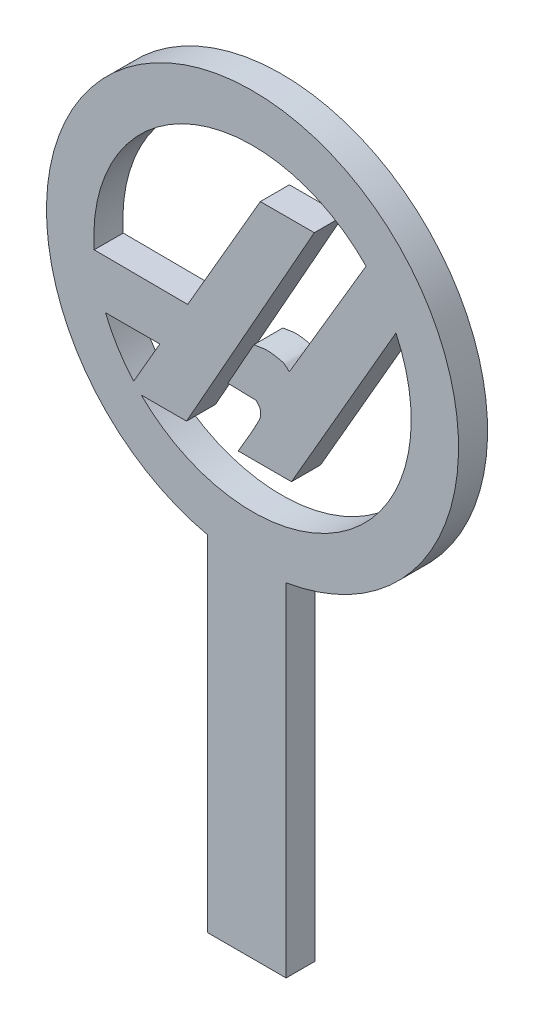
ISO-10303-21;
HEADER;
FILE_DESCRIPTION(('STEP AP214'),'2;1');
FILE_NAME('part.step','',(''),(''),'','','');
FILE_SCHEMA(('AUTOMOTIVE_DESIGN { 1 0 10303 214 1 1 1 1 }'));
ENDSEC;
DATA;
#1=APPLICATION_CONTEXT('core data for automotive mechanical design processes');
#2=APPLICATION_PROTOCOL_DEFINITION('international standard','automotive_design',2000,#1);
#3=PRODUCT_CONTEXT('',#1,'mechanical');
#4=PRODUCT('Part','Part','',(#3));
#5=PRODUCT_RELATED_PRODUCT_CATEGORY('part','',(#4));
#6=PRODUCT_DEFINITION_FORMATION('','',#4);
#7=PRODUCT_DEFINITION_CONTEXT('part definition',#1,'design');
#8=PRODUCT_DEFINITION('design','',#6,#7);
#9=PRODUCT_DEFINITION_SHAPE('','',#8);
#10=(LENGTH_UNIT() NAMED_UNIT(*) SI_UNIT(.MILLI.,.METRE.));
#11=(NAMED_UNIT(*) PLANE_ANGLE_UNIT() SI_UNIT($,.RADIAN.));
#12=(NAMED_UNIT(*) SI_UNIT($,.STERADIAN.) SOLID_ANGLE_UNIT());
#13=UNCERTAINTY_MEASURE_WITH_UNIT(LENGTH_MEASURE(1.E-05),#10,'distance_accuracy_value','');
#14=(GEOMETRIC_REPRESENTATION_CONTEXT(3) GLOBAL_UNCERTAINTY_ASSIGNED_CONTEXT((#13)) GLOBAL_UNIT_ASSIGNED_CONTEXT((#10,
#11,#12)) REPRESENTATION_CONTEXT('',''));
#15=CARTESIAN_POINT('',(0.,0.,0.));
#16=DIRECTION('',(0.,0.,1.));
#17=DIRECTION('',(1.,0.,0.));
#18=AXIS2_PLACEMENT_3D('',#15,#16,#17);
#19=CARTESIAN_POINT('',(456.634031843673,370.7972397232,50.));
#20=DIRECTION('',(0.,0.,1.));
#21=DIRECTION('',(1.,0.,0.));
#22=AXIS2_PLACEMENT_3D('',#19,#20,#21);
#23=PLANE('',#22);
#24=DIRECTION('',(0.,1.,0.));
#25=VECTOR('',#24,1.);
#26=CARTESIAN_POINT('',(514.521168615173,-568.699042703646,50.));
#27=LINE('',#26,#25);
#28=CARTESIAN_POINT('',(514.521168615173,-568.699042703646,50.));
#29=VERTEX_POINT('',#28);
#30=CARTESIAN_POINT('',(514.521168615173,20.7590938354721,50.));
#31=VERTEX_POINT('',#30);
#32=EDGE_CURVE('E347',#29,#31,#27,.T.);
#33=ORIENTED_EDGE('',*,*,#32,.T.);
#34=CARTESIAN_POINT('',(456.634031843673,370.7972397232,50.));
#35=DIRECTION('',(0.,0.,1.));
#36=DIRECTION('',(1.,0.,0.));
#37=AXIS2_PLACEMENT_3D('',#34,#35,#36);
#38=CIRCLE('',#37,354.792367702746);
#39=CARTESIAN_POINT('',(379.382767373746,24.5171994120119,50.));
#40=VERTEX_POINT('',#39);
#41=EDGE_CURVE('E364',#31,#40,#38,.T.);
#42=ORIENTED_EDGE('',*,*,#41,.T.);
#43=DIRECTION('',(0.,-1.,0.));
#44=VECTOR('',#43,1.);
#45=CARTESIAN_POINT('',(379.382767373746,-568.699042703646,50.));
#46=LINE('',#45,#44);
#47=CARTESIAN_POINT('',(379.382767373746,-568.699042703646,50.));
#48=VERTEX_POINT('',#47);
#49=EDGE_CURVE('E338',#40,#48,#46,.T.);
#50=ORIENTED_EDGE('',*,*,#49,.T.);
#51=DIRECTION('',(1.,0.,0.));
#52=VECTOR('',#51,1.);
#53=CARTESIAN_POINT('',(514.521168615173,-568.699042703646,50.));
#54=LINE('',#53,#52);
#55=EDGE_CURVE('E355',#48,#29,#54,.T.);
#56=ORIENTED_EDGE('',*,*,#55,.T.);
#57=EDGE_LOOP('',(#33,#42,#50,#56));
#58=FACE_BOUND('',#57,.T.);
#59=DIRECTION('',(0.999980711178834,-0.00621106031788096,0.));
#60=VECTOR('',#59,1.);
#61=CARTESIAN_POINT('',(344.999999995328,351.000000011869,50.));
#62=LINE('',#61,#60);
#63=CARTESIAN_POINT('',(183.999999995328,352.000000011869,50.));
#64=VERTEX_POINT('',#63);
#65=CARTESIAN_POINT('',(344.999999995328,351.000000011869,50.));
#66=VERTEX_POINT('',#65);
#67=EDGE_CURVE('E222',#64,#66,#62,.T.);
#68=ORIENTED_EDGE('',*,*,#67,.F.);
#69=CARTESIAN_POINT('',(456.634031843673,370.7972397232,50.));
#70=DIRECTION('',(0.,0.,1.));
#71=DIRECTION('',(1.,0.,0.));
#72=AXIS2_PLACEMENT_3D('',#69,#70,#71);
#73=CIRCLE('',#72,273.281268188381);
#74=CARTESIAN_POINT('',(652.184505988232,561.696856287739,50.));
#75=VERTEX_POINT('',#74);
#76=EDGE_CURVE('E219',#75,#64,#73,.T.);
#77=ORIENTED_EDGE('',*,*,#76,.F.);
#78=DIRECTION('',(0.508729312126642,0.860926528214315,0.));
#79=VECTOR('',#78,1.);
#80=CARTESIAN_POINT('',(652.184505988232,561.696856287739,50.));
#81=LINE('',#80,#79);
#82=CARTESIAN_POINT('',(520.000000000014,337.999999999987,50.));
#83=VERTEX_POINT('',#82);
#84=EDGE_CURVE('E462',#83,#75,#81,.T.);
#85=ORIENTED_EDGE('',*,*,#84,.F.);
#86=CARTESIAN_POINT('',(459.000000000014,347.999999999985,50.));
#87=CARTESIAN_POINT('',(477.851743634498,351.141957272399,50.));
#88=CARTESIAN_POINT('',(483.294181496903,353.05040453136,50.));
#89=CARTESIAN_POINT('',(508.000000000014,346.999999999986,50.));
#90=CARTESIAN_POINT('',(512.856486558174,345.81065635309,50.));
#91=CARTESIAN_POINT('',(516.000000000014,340.999999999987,50.));
#92=CARTESIAN_POINT('',(520.000000000014,337.999999999987,50.));
#93=B_SPLINE_CURVE_WITH_KNOTS('',3,(#86,#87,#88,#89,#90,#91,#92),.UNSPECIFIED.,.F.,.F.,(4,3,4),
(0.,1.,2.),.UNSPECIFIED.);
#94=CARTESIAN_POINT('',(459.000000000014,347.999999999985,50.));
#95=VERTEX_POINT('',#94);
#96=EDGE_CURVE('E494',#95,#83,#93,.T.);
#97=ORIENTED_EDGE('',*,*,#96,.F.);
#98=DIRECTION('',(0.488992524128992,0.872287975009376,0.));
#99=VECTOR('',#98,1.);
#100=CARTESIAN_POINT('',(459.000000000014,347.999999999985,50.));
#101=LINE('',#100,#99);
#102=CARTESIAN_POINT('',(414.153111070255,268.000000000617,50.));
#103=VERTEX_POINT('',#102);
#104=EDGE_CURVE('E497',#103,#95,#101,.T.);
#105=ORIENTED_EDGE('',*,*,#104,.F.);
#106=DIRECTION('',(-0.999790511734195,0.020467844201998,0.));
#107=VECTOR('',#106,1.);
#108=CARTESIAN_POINT('',(414.153111070255,268.000000000617,50.));
#109=LINE('',#108,#107);
#110=CARTESIAN_POINT('',(463.000000000014,266.999999999985,50.));
#111=VERTEX_POINT('',#110);
#112=EDGE_CURVE('E253',#111,#103,#109,.T.);
#113=ORIENTED_EDGE('',*,*,#112,.F.);
#114=CARTESIAN_POINT('',(432.000000000013,175.999999999985,50.));
#115=CARTESIAN_POINT('',(444.333333333347,197.999999999985,50.));
#116=CARTESIAN_POINT('',(458.288028235039,219.166586500959,50.));
#117=CARTESIAN_POINT('',(469.000000000014,241.999999999985,50.));
#118=CARTESIAN_POINT('',(471.128314938588,246.536671316419,50.));
#119=CARTESIAN_POINT('',(471.169454920433,252.127271164905,50.));
#120=CARTESIAN_POINT('',(470.000000000014,256.999999999985,50.));
#121=CARTESIAN_POINT('',(469.050440025481,260.956499893871,50.));
#122=CARTESIAN_POINT('',(465.333333333347,263.666666666652,50.));
#123=CARTESIAN_POINT('',(463.000000000014,266.999999999985,50.));
#124=B_SPLINE_CURVE_WITH_KNOTS('',3,(#114,#115,#116,#117,#118,#119,#120,#121,#122,#123),
.UNSPECIFIED.,.F.,.F.,(4,3,3,4),(0.,1.,2.,3.),.UNSPECIFIED.);
#125=CARTESIAN_POINT('',(432.000000000013,175.999999999985,50.));
#126=VERTEX_POINT('',#125);
#127=EDGE_CURVE('E247',#126,#111,#124,.T.);
#128=ORIENTED_EDGE('',*,*,#127,.F.);
#129=DIRECTION('',(-1.,0.,0.));
#130=VECTOR('',#129,1.);
#131=CARTESIAN_POINT('',(432.000000000013,175.999999999985,50.));
#132=LINE('',#131,#130);
#133=CARTESIAN_POINT('',(523.78372406925,175.999999999985,50.));
#134=VERTEX_POINT('',#133);
#135=EDGE_CURVE('E244',#134,#126,#132,.T.);
#136=ORIENTED_EDGE('',*,*,#135,.F.);
#137=DIRECTION('',(-0.499610631852908,-0.866250088911705,0.));
#138=VECTOR('',#137,1.);
#139=CARTESIAN_POINT('',(523.78372406925,175.999999999985,50.));
#140=LINE('',#139,#138);
#141=CARTESIAN_POINT('',(703.607534397801,487.78758367857,50.));
#142=VERTEX_POINT('',#141);
#143=EDGE_CURVE('E241',#142,#134,#140,.T.);
#144=ORIENTED_EDGE('',*,*,#143,.F.);
#145=CARTESIAN_POINT('',(456.634031843673,370.7972397232,50.));
#146=DIRECTION('',(0.,0.,1.));
#147=DIRECTION('',(1.,0.,0.));
#148=AXIS2_PLACEMENT_3D('',#145,#146,#147);
#149=CIRCLE('',#148,273.281268188381);
#150=CARTESIAN_POINT('',(264.996930573145,175.969436370395,50.));
#151=VERTEX_POINT('',#150);
#152=EDGE_CURVE('E238',#151,#142,#149,.T.);
#153=ORIENTED_EDGE('',*,*,#152,.F.);
#154=DIRECTION('',(-0.999999923235036,-0.000391828944071524,0.));
#155=VECTOR('',#154,1.);
#156=CARTESIAN_POINT('',(264.996930573145,175.969436370395,50.));
#157=LINE('',#156,#155);
#158=CARTESIAN_POINT('',(342.999405137408,175.999999999985,50.));
#159=VERTEX_POINT('',#158);
#160=EDGE_CURVE('E235',#159,#151,#157,.T.);
#161=ORIENTED_EDGE('',*,*,#160,.F.);
#162=DIRECTION('',(-0.490368068183299,-0.871515437445706,0.));
#163=VECTOR('',#162,1.);
#164=CARTESIAN_POINT('',(342.999405137408,175.999999999985,50.));
#165=LINE('',#164,#163);
#166=CARTESIAN_POINT('',(562.999999995105,567.000000012326,50.));
#167=VERTEX_POINT('',#166);
#168=EDGE_CURVE('E232',#167,#159,#165,.T.);
#169=ORIENTED_EDGE('',*,*,#168,.F.);
#170=DIRECTION('',(1.,0.,0.));
#171=VECTOR('',#170,1.);
#172=CARTESIAN_POINT('',(562.999999995105,567.000000012326,50.));
#173=LINE('',#172,#171);
#174=CARTESIAN_POINT('',(470.080751257169,567.000000012326,50.));
#175=VERTEX_POINT('',#174);
#176=EDGE_CURVE('E229',#175,#167,#173,.T.);
#177=ORIENTED_EDGE('',*,*,#176,.F.);
#178=DIRECTION('',(0.501120644832425,0.865377431715627,0.));
#179=VECTOR('',#178,1.);
#180=CARTESIAN_POINT('',(470.080751257169,567.000000012326,50.));
#181=LINE('',#180,#179);
#182=EDGE_CURVE('E226',#66,#175,#181,.T.);
#183=ORIENTED_EDGE('',*,*,#182,.F.);
#184=EDGE_LOOP('',(#68,#77,#85,#97,#105,#113,#128,#136,#144,#153,#161,#169,#177,#183));
#185=FACE_BOUND('',#184,.T.);
#186=DIRECTION('',(0.499722453489577,0.866185586048601,0.));
#187=VECTOR('',#186,1.);
#188=CARTESIAN_POINT('',(297.000000000021,268.000000000617,50.));
#189=LINE('',#188,#187);
#190=CARTESIAN_POINT('',(251.884299831457,189.799453041773,50.));
#191=VERTEX_POINT('',#190);
#192=CARTESIAN_POINT('',(297.000000000021,268.000000000617,50.));
#193=VERTEX_POINT('',#192);
#194=EDGE_CURVE('E192',#191,#193,#189,.T.);
#195=ORIENTED_EDGE('',*,*,#194,.F.);
#196=CARTESIAN_POINT('',(456.634031843673,370.7972397232,50.));
#197=DIRECTION('',(0.,0.,1.));
#198=DIRECTION('',(1.,0.,0.));
#199=AXIS2_PLACEMENT_3D('',#196,#197,#198);
#200=CIRCLE('',#199,273.281268188381);
#201=CARTESIAN_POINT('',(203.423883847848,268.000000000617,50.));
#202=VERTEX_POINT('',#201);
#203=EDGE_CURVE('E183',#202,#191,#200,.T.);
#204=ORIENTED_EDGE('',*,*,#203,.F.);
#205=DIRECTION('',(-1.,0.,0.));
#206=VECTOR('',#205,1.);
#207=CARTESIAN_POINT('',(203.423883847848,268.000000000617,50.));
#208=LINE('',#207,#206);
#209=EDGE_CURVE('E202',#193,#202,#208,.T.);
#210=ORIENTED_EDGE('',*,*,#209,.F.);
#211=EDGE_LOOP('',(#195,#204,#210));
#212=FACE_BOUND('',#211,.T.);
#213=ADVANCED_FACE('F39',(#58,#185,#212),#23,.T.);
#214=CARTESIAN_POINT('',(456.634031843673,370.7972397232,0.));
#215=DIRECTION('',(0.,0.,1.));
#216=DIRECTION('',(1.,0.,0.));
#217=AXIS2_PLACEMENT_3D('',#214,#215,#216);
#218=PLANE('',#217);
#219=CARTESIAN_POINT('',(456.634031843673,370.7972397232,0.));
#220=DIRECTION('',(0.,0.,1.));
#221=DIRECTION('',(1.,0.,0.));
#222=AXIS2_PLACEMENT_3D('',#219,#220,#221);
#223=CIRCLE('',#222,273.281268188381);
#224=CARTESIAN_POINT('',(652.184505988232,561.696856287739,0.));
#225=VERTEX_POINT('',#224);
#226=CARTESIAN_POINT('',(183.999999995328,352.000000011869,0.));
#227=VERTEX_POINT('',#226);
#228=EDGE_CURVE('E200',#225,#227,#223,.T.);
#229=ORIENTED_EDGE('',*,*,#228,.T.);
#230=DIRECTION('',(0.999980711178834,-0.00621106031788096,0.));
#231=VECTOR('',#230,1.);
#232=CARTESIAN_POINT('',(344.999999995328,351.000000011869,0.));
#233=LINE('',#232,#231);
#234=CARTESIAN_POINT('',(344.999999995328,351.000000011869,0.));
#235=VERTEX_POINT('',#234);
#236=EDGE_CURVE('E398',#227,#235,#233,.T.);
#237=ORIENTED_EDGE('',*,*,#236,.T.);
#238=DIRECTION('',(0.501120644832425,0.865377431715627,0.));
#239=VECTOR('',#238,1.);
#240=CARTESIAN_POINT('',(470.080751257169,567.000000012326,0.));
#241=LINE('',#240,#239);
#242=CARTESIAN_POINT('',(470.080751257169,567.000000012326,0.));
#243=VERTEX_POINT('',#242);
#244=EDGE_CURVE('E392',#235,#243,#241,.T.);
#245=ORIENTED_EDGE('',*,*,#244,.T.);
#246=DIRECTION('',(1.,0.,0.));
#247=VECTOR('',#246,1.);
#248=CARTESIAN_POINT('',(562.999999995105,567.000000012326,0.));
#249=LINE('',#248,#247);
#250=CARTESIAN_POINT('',(562.999999995105,567.000000012326,0.));
#251=VERTEX_POINT('',#250);
#252=EDGE_CURVE('E397',#243,#251,#249,.T.);
#253=ORIENTED_EDGE('',*,*,#252,.T.);
#254=DIRECTION('',(-0.490368068183299,-0.871515437445706,0.));
#255=VECTOR('',#254,1.);
#256=CARTESIAN_POINT('',(342.999405137408,175.999999999985,0.));
#257=LINE('',#256,#255);
#258=CARTESIAN_POINT('',(342.999405137408,175.999999999985,0.));
#259=VERTEX_POINT('',#258);
#260=EDGE_CURVE('E409',#251,#259,#257,.T.);
#261=ORIENTED_EDGE('',*,*,#260,.T.);
#262=DIRECTION('',(-0.999999923235036,-0.000391828944071524,0.));
#263=VECTOR('',#262,1.);
#264=CARTESIAN_POINT('',(264.996930573145,175.969436370395,0.));
#265=LINE('',#264,#263);
#266=CARTESIAN_POINT('',(264.996930573145,175.969436370395,0.));
#267=VERTEX_POINT('',#266);
#268=EDGE_CURVE('E413',#259,#267,#265,.T.);
#269=ORIENTED_EDGE('',*,*,#268,.T.);
#270=CARTESIAN_POINT('',(456.634031843673,370.7972397232,0.));
#271=DIRECTION('',(0.,0.,1.));
#272=DIRECTION('',(1.,0.,0.));
#273=AXIS2_PLACEMENT_3D('',#270,#271,#272);
#274=CIRCLE('',#273,273.281268188381);
#275=CARTESIAN_POINT('',(703.607534397801,487.78758367857,0.));
#276=VERTEX_POINT('',#275);
#277=EDGE_CURVE('E417',#267,#276,#274,.T.);
#278=ORIENTED_EDGE('',*,*,#277,.T.);
#279=DIRECTION('',(-0.499610631852908,-0.866250088911705,0.));
#280=VECTOR('',#279,1.);
#281=CARTESIAN_POINT('',(523.78372406925,175.999999999985,0.));
#282=LINE('',#281,#280);
#283=CARTESIAN_POINT('',(523.78372406925,175.999999999985,0.));
#284=VERTEX_POINT('',#283);
#285=EDGE_CURVE('E421',#276,#284,#282,.T.);
#286=ORIENTED_EDGE('',*,*,#285,.T.);
#287=DIRECTION('',(-1.,0.,0.));
#288=VECTOR('',#287,1.);
#289=CARTESIAN_POINT('',(432.000000000013,175.999999999985,0.));
#290=LINE('',#289,#288);
#291=CARTESIAN_POINT('',(432.000000000013,175.999999999985,0.));
#292=VERTEX_POINT('',#291);
#293=EDGE_CURVE('E425',#284,#292,#290,.T.);
#294=ORIENTED_EDGE('',*,*,#293,.T.);
#295=CARTESIAN_POINT('',(432.000000000013,175.999999999985,0.));
#296=CARTESIAN_POINT('',(444.333333333347,197.999999999985,0.));
#297=CARTESIAN_POINT('',(458.288028235039,219.166586500959,0.));
#298=CARTESIAN_POINT('',(469.000000000014,241.999999999985,0.));
#299=CARTESIAN_POINT('',(471.128314938588,246.536671316419,0.));
#300=CARTESIAN_POINT('',(471.169454920433,252.127271164905,0.));
#301=CARTESIAN_POINT('',(470.000000000014,256.999999999985,0.));
#302=CARTESIAN_POINT('',(469.050440025481,260.956499893871,0.));
#303=CARTESIAN_POINT('',(465.333333333347,263.666666666652,0.));
#304=CARTESIAN_POINT('',(463.000000000014,266.999999999985,0.));
#305=B_SPLINE_CURVE_WITH_KNOTS('',3,(#295,#296,#297,#298,#299,#300,#301,#302,#303,#304),
.UNSPECIFIED.,.F.,.F.,(4,3,3,4),(0.,1.,2.,3.),.UNSPECIFIED.);
#306=CARTESIAN_POINT('',(463.000000000014,266.999999999985,0.));
#307=VERTEX_POINT('',#306);
#308=EDGE_CURVE('E429',#292,#307,#305,.T.);
#309=ORIENTED_EDGE('',*,*,#308,.T.);
#310=DIRECTION('',(-0.999790511734195,0.020467844201998,0.));
#311=VECTOR('',#310,1.);
#312=CARTESIAN_POINT('',(414.153111070255,268.000000000617,0.));
#313=LINE('',#312,#311);
#314=CARTESIAN_POINT('',(414.153111070255,268.000000000617,0.));
#315=VERTEX_POINT('',#314);
#316=EDGE_CURVE('E435',#307,#315,#313,.T.);
#317=ORIENTED_EDGE('',*,*,#316,.T.);
#318=DIRECTION('',(0.488992524128992,0.872287975009376,0.));
#319=VECTOR('',#318,1.);
#320=CARTESIAN_POINT('',(459.000000000014,347.999999999985,0.));
#321=LINE('',#320,#319);
#322=CARTESIAN_POINT('',(459.000000000014,347.999999999985,0.));
#323=VERTEX_POINT('',#322);
#324=EDGE_CURVE('E442',#315,#323,#321,.T.);
#325=ORIENTED_EDGE('',*,*,#324,.T.);
#326=CARTESIAN_POINT('',(459.000000000014,347.999999999985,0.));
#327=CARTESIAN_POINT('',(477.851743634498,351.141957272399,0.));
#328=CARTESIAN_POINT('',(483.294181496903,353.05040453136,0.));
#329=CARTESIAN_POINT('',(508.000000000014,346.999999999986,0.));
#330=CARTESIAN_POINT('',(512.856486558174,345.81065635309,0.));
#331=CARTESIAN_POINT('',(516.000000000014,340.999999999987,0.));
#332=CARTESIAN_POINT('',(520.000000000014,337.999999999987,0.));
#333=B_SPLINE_CURVE_WITH_KNOTS('',3,(#326,#327,#328,#329,#330,#331,#332),.UNSPECIFIED.,.F.,.F.,
(4,3,4),(0.,1.,2.),.UNSPECIFIED.);
#334=CARTESIAN_POINT('',(520.000000000014,337.999999999987,0.));
#335=VERTEX_POINT('',#334);
#336=EDGE_CURVE('E446',#323,#335,#333,.T.);
#337=ORIENTED_EDGE('',*,*,#336,.T.);
#338=DIRECTION('',(0.508729312126642,0.860926528214315,0.));
#339=VECTOR('',#338,1.);
#340=CARTESIAN_POINT('',(652.184505988232,561.696856287739,0.));
#341=LINE('',#340,#339);
#342=EDGE_CURVE('E223',#335,#225,#341,.T.);
#343=ORIENTED_EDGE('',*,*,#342,.T.);
#344=EDGE_LOOP('',(#229,#237,#245,#253,#261,#269,#278,#286,#294,#309,#317,#325,#337,#343));
#345=FACE_BOUND('',#344,.T.);
#346=DIRECTION('',(0.,1.,0.));
#347=VECTOR('',#346,1.);
#348=CARTESIAN_POINT('',(514.521168615173,-568.699042703646,0.));
#349=LINE('',#348,#347);
#350=CARTESIAN_POINT('',(514.521168615173,-568.699042703646,0.));
#351=VERTEX_POINT('',#350);
#352=CARTESIAN_POINT('',(514.521168615173,20.7590938354721,0.));
#353=VERTEX_POINT('',#352);
#354=EDGE_CURVE('E334',#351,#353,#349,.T.);
#355=ORIENTED_EDGE('',*,*,#354,.F.);
#356=DIRECTION('',(1.,0.,0.));
#357=VECTOR('',#356,1.);
#358=CARTESIAN_POINT('',(514.521168615173,-568.699042703646,0.));
#359=LINE('',#358,#357);
#360=CARTESIAN_POINT('',(379.382767373746,-568.699042703646,0.));
#361=VERTEX_POINT('',#360);
#362=EDGE_CURVE('E343',#361,#351,#359,.T.);
#363=ORIENTED_EDGE('',*,*,#362,.F.);
#364=DIRECTION('',(0.,-1.,0.));
#365=VECTOR('',#364,1.);
#366=CARTESIAN_POINT('',(379.382767373746,-568.699042703646,0.));
#367=LINE('',#366,#365);
#368=CARTESIAN_POINT('',(379.382767373746,24.5171994120119,0.));
#369=VERTEX_POINT('',#368);
#370=EDGE_CURVE('E333',#369,#361,#367,.T.);
#371=ORIENTED_EDGE('',*,*,#370,.F.);
#372=CARTESIAN_POINT('',(456.634031843673,370.7972397232,0.));
#373=DIRECTION('',(0.,0.,1.));
#374=DIRECTION('',(1.,0.,0.));
#375=AXIS2_PLACEMENT_3D('',#372,#373,#374);
#376=CIRCLE('',#375,354.792367702746);
#377=EDGE_CURVE('E324',#353,#369,#376,.T.);
#378=ORIENTED_EDGE('',*,*,#377,.F.);
#379=EDGE_LOOP('',(#355,#363,#371,#378));
#380=FACE_BOUND('',#379,.T.);
#381=CARTESIAN_POINT('',(456.634031843673,370.7972397232,0.));
#382=DIRECTION('',(0.,0.,1.));
#383=DIRECTION('',(1.,0.,0.));
#384=AXIS2_PLACEMENT_3D('',#381,#382,#383);
#385=CIRCLE('',#384,273.281268188381);
#386=CARTESIAN_POINT('',(203.423883847848,268.000000000617,0.));
#387=VERTEX_POINT('',#386);
#388=CARTESIAN_POINT('',(251.884299831457,189.799453041773,0.));
#389=VERTEX_POINT('',#388);
#390=EDGE_CURVE('E63',#387,#389,#385,.T.);
#391=ORIENTED_EDGE('',*,*,#390,.T.);
#392=DIRECTION('',(0.499722453489577,0.866185586048601,0.));
#393=VECTOR('',#392,1.);
#394=CARTESIAN_POINT('',(297.000000000021,268.000000000617,0.));
#395=LINE('',#394,#393);
#396=CARTESIAN_POINT('',(297.000000000021,268.000000000617,0.));
#397=VERTEX_POINT('',#396);
#398=EDGE_CURVE('E198',#389,#397,#395,.T.);
#399=ORIENTED_EDGE('',*,*,#398,.T.);
#400=DIRECTION('',(-1.,0.,0.));
#401=VECTOR('',#400,1.);
#402=CARTESIAN_POINT('',(203.423883847848,268.000000000617,0.));
#403=LINE('',#402,#401);
#404=EDGE_CURVE('E193',#397,#387,#403,.T.);
#405=ORIENTED_EDGE('',*,*,#404,.T.);
#406=EDGE_LOOP('',(#391,#399,#405));
#407=FACE_BOUND('',#406,.T.);
#408=ADVANCED_FACE('F305',(#345,#380,#407),#218,.F.);
#409=CARTESIAN_POINT('',(514.521168615173,-568.699042703646,50.));
#410=DIRECTION('',(-1.,0.,0.));
#411=DIRECTION('',(0.,0.,1.));
#412=AXIS2_PLACEMENT_3D('',#409,#410,#411);
#413=PLANE('',#412);
#414=ORIENTED_EDGE('',*,*,#354,.T.);
#415=DIRECTION('',(0.,0.,-1.));
#416=VECTOR('',#415,1.);
#417=CARTESIAN_POINT('',(514.521168615173,20.7590938354721,50.));
#418=LINE('',#417,#416);
#419=EDGE_CURVE('E11',#31,#353,#418,.T.);
#420=ORIENTED_EDGE('',*,*,#419,.F.);
#421=ORIENTED_EDGE('',*,*,#32,.F.);
#422=DIRECTION('',(0.,0.,-1.));
#423=VECTOR('',#422,1.);
#424=CARTESIAN_POINT('',(514.521168615173,-568.699042703646,50.));
#425=LINE('',#424,#423);
#426=EDGE_CURVE('E351',#29,#351,#425,.T.);
#427=ORIENTED_EDGE('',*,*,#426,.T.);
#428=EDGE_LOOP('',(#414,#420,#421,#427));
#429=FACE_BOUND('',#428,.T.);
#430=ADVANCED_FACE('F41',(#429),#413,.F.);
#431=CARTESIAN_POINT('',(456.634031843673,370.7972397232,50.));
#432=DIRECTION('',(0.,0.,-1.));
#433=DIRECTION('',(-1.,0.,0.));
#434=AXIS2_PLACEMENT_3D('',#431,#432,#433);
#435=CYLINDRICAL_SURFACE('',#434,354.792367702746);
#436=ORIENTED_EDGE('',*,*,#377,.T.);
#437=DIRECTION('',(0.,0.,-1.));
#438=VECTOR('',#437,1.);
#439=CARTESIAN_POINT('',(379.382767373746,24.5171994120119,50.));
#440=LINE('',#439,#438);
#441=EDGE_CURVE('E48',#40,#369,#440,.T.);
#442=ORIENTED_EDGE('',*,*,#441,.F.);
#443=ORIENTED_EDGE('',*,*,#41,.F.);
#444=ORIENTED_EDGE('',*,*,#419,.T.);
#445=EDGE_LOOP('',(#436,#442,#443,#444));
#446=FACE_BOUND('',#445,.T.);
#447=ADVANCED_FACE('F315',(#446),#435,.T.);
#448=CARTESIAN_POINT('',(379.382767373746,-568.699042703646,50.));
#449=DIRECTION('',(1.,0.,0.));
#450=DIRECTION('',(0.,0.,-1.));
#451=AXIS2_PLACEMENT_3D('',#448,#449,#450);
#452=PLANE('',#451);
#453=ORIENTED_EDGE('',*,*,#370,.T.);
#454=DIRECTION('',(0.,0.,-1.));
#455=VECTOR('',#454,1.);
#456=CARTESIAN_POINT('',(379.382767373746,-568.699042703646,50.));
#457=LINE('',#456,#455);
#458=EDGE_CURVE('E340',#48,#361,#457,.T.);
#459=ORIENTED_EDGE('',*,*,#458,.F.);
#460=ORIENTED_EDGE('',*,*,#49,.F.);
#461=ORIENTED_EDGE('',*,*,#441,.T.);
#462=EDGE_LOOP('',(#453,#459,#460,#461));
#463=FACE_BOUND('',#462,.T.);
#464=ADVANCED_FACE('F312',(#463),#452,.F.);
#465=CARTESIAN_POINT('',(514.521168615173,-568.699042703646,50.));
#466=DIRECTION('',(0.,1.,0.));
#467=DIRECTION('',(0.,0.,1.));
#468=AXIS2_PLACEMENT_3D('',#465,#466,#467);
#469=PLANE('',#468);
#470=ORIENTED_EDGE('',*,*,#362,.T.);
#471=ORIENTED_EDGE('',*,*,#426,.F.);
#472=ORIENTED_EDGE('',*,*,#55,.F.);
#473=ORIENTED_EDGE('',*,*,#458,.T.);
#474=EDGE_LOOP('',(#470,#471,#472,#473));
#475=FACE_BOUND('',#474,.T.);
#476=ADVANCED_FACE('F301',(#475),#469,.F.);
#477=CARTESIAN_POINT('',(456.634031843673,370.7972397232,50.));
#478=DIRECTION('',(0.,0.,-1.));
#479=DIRECTION('',(-1.,0.,0.));
#480=AXIS2_PLACEMENT_3D('',#477,#478,#479);
#481=CYLINDRICAL_SURFACE('',#480,273.281268188381);
#482=ORIENTED_EDGE('',*,*,#228,.F.);
#483=DIRECTION('',(0.,0.,-1.));
#484=VECTOR('',#483,1.);
#485=CARTESIAN_POINT('',(652.184505988232,561.696856287739,50.));
#486=LINE('',#485,#484);
#487=EDGE_CURVE('E457',#75,#225,#486,.T.);
#488=ORIENTED_EDGE('',*,*,#487,.F.);
#489=ORIENTED_EDGE('',*,*,#76,.T.);
#490=DIRECTION('',(0.,0.,-1.));
#491=VECTOR('',#490,1.);
#492=CARTESIAN_POINT('',(183.999999995328,352.000000011869,50.));
#493=LINE('',#492,#491);
#494=EDGE_CURVE('E368',#64,#227,#493,.T.);
#495=ORIENTED_EDGE('',*,*,#494,.T.);
#496=EDGE_LOOP('',(#482,#488,#489,#495));
#497=FACE_BOUND('',#496,.T.);
#498=ADVANCED_FACE('F297',(#497),#481,.F.);
#499=CARTESIAN_POINT('',(344.999999995328,351.000000011869,50.));
#500=DIRECTION('',(0.00621106031788096,0.999980711178834,0.));
#501=DIRECTION('',(-0.999980711178835,0.00621106031788096,0.));
#502=AXIS2_PLACEMENT_3D('',#499,#500,#501);
#503=PLANE('',#502);
#504=ORIENTED_EDGE('',*,*,#236,.F.);
#505=ORIENTED_EDGE('',*,*,#494,.F.);
#506=ORIENTED_EDGE('',*,*,#67,.T.);
#507=DIRECTION('',(0.,0.,-1.));
#508=VECTOR('',#507,1.);
#509=CARTESIAN_POINT('',(344.999999995328,351.000000011869,50.));
#510=LINE('',#509,#508);
#511=EDGE_CURVE('E371',#66,#235,#510,.T.);
#512=ORIENTED_EDGE('',*,*,#511,.T.);
#513=EDGE_LOOP('',(#504,#505,#506,#512));
#514=FACE_BOUND('',#513,.T.);
#515=ADVANCED_FACE('F293',(#514),#503,.T.);
#516=CARTESIAN_POINT('',(470.080751257169,567.000000012326,50.));
#517=DIRECTION('',(-0.865377431715627,0.501120644832425,0.));
#518=DIRECTION('',(-0.501120644832425,-0.865377431715627,0.));
#519=AXIS2_PLACEMENT_3D('',#516,#517,#518);
#520=PLANE('',#519);
#521=ORIENTED_EDGE('',*,*,#244,.F.);
#522=ORIENTED_EDGE('',*,*,#511,.F.);
#523=ORIENTED_EDGE('',*,*,#182,.T.);
#524=DIRECTION('',(0.,0.,-1.));
#525=VECTOR('',#524,1.);
#526=CARTESIAN_POINT('',(470.080751257169,567.000000012326,50.));
#527=LINE('',#526,#525);
#528=EDGE_CURVE('E376',#175,#243,#527,.T.);
#529=ORIENTED_EDGE('',*,*,#528,.T.);
#530=EDGE_LOOP('',(#521,#522,#523,#529));
#531=FACE_BOUND('',#530,.T.);
#532=ADVANCED_FACE('F289',(#531),#520,.T.);
#533=CARTESIAN_POINT('',(562.999999995105,567.000000012326,50.));
#534=DIRECTION('',(0.,1.,0.));
#535=DIRECTION('',(-1.,0.,0.));
#536=AXIS2_PLACEMENT_3D('',#533,#534,#535);
#537=PLANE('',#536);
#538=ORIENTED_EDGE('',*,*,#252,.F.);
#539=ORIENTED_EDGE('',*,*,#528,.F.);
#540=ORIENTED_EDGE('',*,*,#176,.T.);
#541=DIRECTION('',(0.,0.,-1.));
#542=VECTOR('',#541,1.);
#543=CARTESIAN_POINT('',(562.999999995105,567.000000012326,50.));
#544=LINE('',#543,#542);
#545=EDGE_CURVE('E489',#167,#251,#544,.T.);
#546=ORIENTED_EDGE('',*,*,#545,.T.);
#547=EDGE_LOOP('',(#538,#539,#540,#546));
#548=FACE_BOUND('',#547,.T.);
#549=ADVANCED_FACE('F285',(#548),#537,.T.);
#550=CARTESIAN_POINT('',(342.999405137408,175.999999999985,50.));
#551=DIRECTION('',(0.871515437445706,-0.490368068183298,0.));
#552=DIRECTION('',(0.490368068183299,0.871515437445706,0.));
#553=AXIS2_PLACEMENT_3D('',#550,#551,#552);
#554=PLANE('',#553);
#555=ORIENTED_EDGE('',*,*,#260,.F.);
#556=ORIENTED_EDGE('',*,*,#545,.F.);
#557=ORIENTED_EDGE('',*,*,#168,.T.);
#558=DIRECTION('',(0.,0.,-1.));
#559=VECTOR('',#558,1.);
#560=CARTESIAN_POINT('',(342.999405137408,175.999999999985,50.));
#561=LINE('',#560,#559);
#562=EDGE_CURVE('E486',#159,#259,#561,.T.);
#563=ORIENTED_EDGE('',*,*,#562,.T.);
#564=EDGE_LOOP('',(#555,#556,#557,#563));
#565=FACE_BOUND('',#564,.T.);
#566=ADVANCED_FACE('F281',(#565),#554,.T.);
#567=CARTESIAN_POINT('',(264.996930573145,175.969436370395,50.));
#568=DIRECTION('',(0.000391828944071524,-0.999999923235036,0.));
#569=DIRECTION('',(0.999999923235037,0.000391828944071524,0.));
#570=AXIS2_PLACEMENT_3D('',#567,#568,#569);
#571=PLANE('',#570);
#572=ORIENTED_EDGE('',*,*,#268,.F.);
#573=ORIENTED_EDGE('',*,*,#562,.F.);
#574=ORIENTED_EDGE('',*,*,#160,.T.);
#575=DIRECTION('',(0.,0.,-1.));
#576=VECTOR('',#575,1.);
#577=CARTESIAN_POINT('',(264.996930573145,175.969436370395,50.));
#578=LINE('',#577,#576);
#579=EDGE_CURVE('E483',#151,#267,#578,.T.);
#580=ORIENTED_EDGE('',*,*,#579,.T.);
#581=EDGE_LOOP('',(#572,#573,#574,#580));
#582=FACE_BOUND('',#581,.T.);
#583=ADVANCED_FACE('F277',(#582),#571,.T.);
#584=CARTESIAN_POINT('',(456.634031843673,370.7972397232,50.));
#585=DIRECTION('',(0.,0.,-1.));
#586=DIRECTION('',(-1.,0.,0.));
#587=AXIS2_PLACEMENT_3D('',#584,#585,#586);
#588=CYLINDRICAL_SURFACE('',#587,273.281268188381);
#589=ORIENTED_EDGE('',*,*,#277,.F.);
#590=ORIENTED_EDGE('',*,*,#579,.F.);
#591=ORIENTED_EDGE('',*,*,#152,.T.);
#592=DIRECTION('',(0.,0.,-1.));
#593=VECTOR('',#592,1.);
#594=CARTESIAN_POINT('',(703.607534397801,487.78758367857,50.));
#595=LINE('',#594,#593);
#596=EDGE_CURVE('E480',#142,#276,#595,.T.);
#597=ORIENTED_EDGE('',*,*,#596,.T.);
#598=EDGE_LOOP('',(#589,#590,#591,#597));
#599=FACE_BOUND('',#598,.T.);
#600=ADVANCED_FACE('F273',(#599),#588,.F.);
#601=CARTESIAN_POINT('',(523.78372406925,175.999999999985,50.));
#602=DIRECTION('',(0.866250088911705,-0.499610631852908,0.));
#603=DIRECTION('',(0.499610631852909,0.866250088911706,0.));
#604=AXIS2_PLACEMENT_3D('',#601,#602,#603);
#605=PLANE('',#604);
#606=ORIENTED_EDGE('',*,*,#285,.F.);
#607=ORIENTED_EDGE('',*,*,#596,.F.);
#608=ORIENTED_EDGE('',*,*,#143,.T.);
#609=DIRECTION('',(0.,0.,-1.));
#610=VECTOR('',#609,1.);
#611=CARTESIAN_POINT('',(523.78372406925,175.999999999985,50.));
#612=LINE('',#611,#610);
#613=EDGE_CURVE('E477',#134,#284,#612,.T.);
#614=ORIENTED_EDGE('',*,*,#613,.T.);
#615=EDGE_LOOP('',(#606,#607,#608,#614));
#616=FACE_BOUND('',#615,.T.);
#617=ADVANCED_FACE('F269',(#616),#605,.T.);
#618=CARTESIAN_POINT('',(432.000000000013,175.999999999985,50.));
#619=DIRECTION('',(0.,-1.,0.));
#620=DIRECTION('',(0.,0.,-1.));
#621=AXIS2_PLACEMENT_3D('',#618,#619,#620);
#622=PLANE('',#621);
#623=ORIENTED_EDGE('',*,*,#293,.F.);
#624=ORIENTED_EDGE('',*,*,#613,.F.);
#625=ORIENTED_EDGE('',*,*,#135,.T.);
#626=DIRECTION('',(0.,0.,-1.));
#627=VECTOR('',#626,1.);
#628=CARTESIAN_POINT('',(432.000000000013,175.999999999985,50.));
#629=LINE('',#628,#627);
#630=EDGE_CURVE('E474',#126,#292,#629,.T.);
#631=ORIENTED_EDGE('',*,*,#630,.T.);
#632=EDGE_LOOP('',(#623,#624,#625,#631));
#633=FACE_BOUND('',#632,.T.);
#634=ADVANCED_FACE('F264',(#633),#622,.T.);
#635=DIRECTION('',(0.,0.,-1.));
#636=VECTOR('',#635,1.);
#637=SURFACE_OF_LINEAR_EXTRUSION('',#124,#636);
#638=ORIENTED_EDGE('',*,*,#308,.F.);
#639=ORIENTED_EDGE('',*,*,#630,.F.);
#640=ORIENTED_EDGE('',*,*,#127,.T.);
#641=DIRECTION('',(0.,0.,-1.));
#642=VECTOR('',#641,1.);
#643=CARTESIAN_POINT('',(463.000000000014,266.999999999985,50.));
#644=LINE('',#643,#642);
#645=EDGE_CURVE('E471',#111,#307,#644,.T.);
#646=ORIENTED_EDGE('',*,*,#645,.T.);
#647=EDGE_LOOP('',(#638,#639,#640,#646));
#648=FACE_BOUND('',#647,.T.);
#649=ADVANCED_FACE('F259',(#648),#637,.T.);
#650=CARTESIAN_POINT('',(414.153111070255,268.000000000617,50.));
#651=DIRECTION('',(-0.020467844201998,-0.999790511734195,0.));
#652=DIRECTION('',(0.999790511734195,-0.020467844201998,0.));
#653=AXIS2_PLACEMENT_3D('',#650,#651,#652);
#654=PLANE('',#653);
#655=ORIENTED_EDGE('',*,*,#316,.F.);
#656=ORIENTED_EDGE('',*,*,#645,.F.);
#657=ORIENTED_EDGE('',*,*,#112,.T.);
#658=DIRECTION('',(0.,0.,-1.));
#659=VECTOR('',#658,1.);
#660=CARTESIAN_POINT('',(414.153111070255,268.000000000617,50.));
#661=LINE('',#660,#659);
#662=EDGE_CURVE('E468',#103,#315,#661,.T.);
#663=ORIENTED_EDGE('',*,*,#662,.T.);
#664=EDGE_LOOP('',(#655,#656,#657,#663));
#665=FACE_BOUND('',#664,.T.);
#666=ADVANCED_FACE('F263',(#665),#654,.T.);
#667=CARTESIAN_POINT('',(459.000000000014,347.999999999985,50.));
#668=DIRECTION('',(-0.872287975009376,0.488992524128992,0.));
#669=DIRECTION('',(-0.488992524128992,-0.872287975009376,0.));
#670=AXIS2_PLACEMENT_3D('',#667,#668,#669);
#671=PLANE('',#670);
#672=ORIENTED_EDGE('',*,*,#324,.F.);
#673=ORIENTED_EDGE('',*,*,#662,.F.);
#674=ORIENTED_EDGE('',*,*,#104,.T.);
#675=DIRECTION('',(0.,0.,-1.));
#676=VECTOR('',#675,1.);
#677=CARTESIAN_POINT('',(459.000000000014,347.999999999985,50.));
#678=LINE('',#677,#676);
#679=EDGE_CURVE('E465',#95,#323,#678,.T.);
#680=ORIENTED_EDGE('',*,*,#679,.T.);
#681=EDGE_LOOP('',(#672,#673,#674,#680));
#682=FACE_BOUND('',#681,.T.);
#683=ADVANCED_FACE('F509',(#682),#671,.T.);
#684=DIRECTION('',(0.,0.,-1.));
#685=VECTOR('',#684,1.);
#686=SURFACE_OF_LINEAR_EXTRUSION('',#93,#685);
#687=ORIENTED_EDGE('',*,*,#336,.F.);
#688=ORIENTED_EDGE('',*,*,#679,.F.);
#689=ORIENTED_EDGE('',*,*,#96,.T.);
#690=DIRECTION('',(0.,0.,-1.));
#691=VECTOR('',#690,1.);
#692=CARTESIAN_POINT('',(520.000000000014,337.999999999987,50.));
#693=LINE('',#692,#691);
#694=EDGE_CURVE('E461',#83,#335,#693,.T.);
#695=ORIENTED_EDGE('',*,*,#694,.T.);
#696=EDGE_LOOP('',(#687,#688,#689,#695));
#697=FACE_BOUND('',#696,.T.);
#698=ADVANCED_FACE('F514',(#697),#686,.T.);
#699=CARTESIAN_POINT('',(652.184505988232,561.696856287739,50.));
#700=DIRECTION('',(-0.860926528214315,0.508729312126642,0.));
#701=DIRECTION('',(-0.508729312126642,-0.860926528214315,0.));
#702=AXIS2_PLACEMENT_3D('',#699,#700,#701);
#703=PLANE('',#702);
#704=ORIENTED_EDGE('',*,*,#342,.F.);
#705=ORIENTED_EDGE('',*,*,#694,.F.);
#706=ORIENTED_EDGE('',*,*,#84,.T.);
#707=ORIENTED_EDGE('',*,*,#487,.T.);
#708=EDGE_LOOP('',(#704,#705,#706,#707));
#709=FACE_BOUND('',#708,.T.);
#710=ADVANCED_FACE('F534',(#709),#703,.T.);
#711=CARTESIAN_POINT('',(456.634031843673,370.7972397232,50.));
#712=DIRECTION('',(0.,0.,-1.));
#713=DIRECTION('',(-1.,0.,0.));
#714=AXIS2_PLACEMENT_3D('',#711,#712,#713);
#715=CYLINDRICAL_SURFACE('',#714,273.281268188381);
#716=ORIENTED_EDGE('',*,*,#390,.F.);
#717=DIRECTION('',(0.,0.,-1.));
#718=VECTOR('',#717,1.);
#719=CARTESIAN_POINT('',(203.423883847848,268.000000000617,50.));
#720=LINE('',#719,#718);
#721=EDGE_CURVE('E187',#202,#387,#720,.T.);
#722=ORIENTED_EDGE('',*,*,#721,.F.);
#723=ORIENTED_EDGE('',*,*,#203,.T.);
#724=DIRECTION('',(0.,0.,-1.));
#725=VECTOR('',#724,1.);
#726=CARTESIAN_POINT('',(251.884299831457,189.799453041773,50.));
#727=LINE('',#726,#725);
#728=EDGE_CURVE('E186',#191,#389,#727,.T.);
#729=ORIENTED_EDGE('',*,*,#728,.T.);
#730=EDGE_LOOP('',(#716,#722,#723,#729));
#731=FACE_BOUND('',#730,.T.);
#732=ADVANCED_FACE('F185',(#731),#715,.F.);
#733=CARTESIAN_POINT('',(297.000000000021,268.000000000617,50.));
#734=DIRECTION('',(-0.866185586048601,0.499722453489577,0.));
#735=DIRECTION('',(-0.499722453489577,-0.866185586048601,0.));
#736=AXIS2_PLACEMENT_3D('',#733,#734,#735);
#737=PLANE('',#736);
#738=ORIENTED_EDGE('',*,*,#398,.F.);
#739=ORIENTED_EDGE('',*,*,#728,.F.);
#740=ORIENTED_EDGE('',*,*,#194,.T.);
#741=DIRECTION('',(0.,0.,-1.));
#742=VECTOR('',#741,1.);
#743=CARTESIAN_POINT('',(297.000000000021,268.000000000617,50.));
#744=LINE('',#743,#742);
#745=EDGE_CURVE('E55',#193,#397,#744,.T.);
#746=ORIENTED_EDGE('',*,*,#745,.T.);
#747=EDGE_LOOP('',(#738,#739,#740,#746));
#748=FACE_BOUND('',#747,.T.);
#749=ADVANCED_FACE('F196',(#748),#737,.T.);
#750=CARTESIAN_POINT('',(203.423883847848,268.000000000617,50.));
#751=DIRECTION('',(0.,-1.,0.));
#752=DIRECTION('',(0.,0.,-1.));
#753=AXIS2_PLACEMENT_3D('',#750,#751,#752);
#754=PLANE('',#753);
#755=ORIENTED_EDGE('',*,*,#404,.F.);
#756=ORIENTED_EDGE('',*,*,#745,.F.);
#757=ORIENTED_EDGE('',*,*,#209,.T.);
#758=ORIENTED_EDGE('',*,*,#721,.T.);
#759=EDGE_LOOP('',(#755,#756,#757,#758));
#760=FACE_BOUND('',#759,.T.);
#761=ADVANCED_FACE('F679',(#760),#754,.T.);
#762=CLOSED_SHELL('',(#213,#408,#430,#447,#464,#476,#498,#515,#532,#549,#566,#583,#600,#617,
#634,#649,#666,#683,#698,#710,#732,#749,#761));
#763=MANIFOLD_SOLID_BREP('B2',#762);
#764=ADVANCED_BREP_SHAPE_REPRESENTATION('',(#18,#763),#14);
#765=SHAPE_DEFINITION_REPRESENTATION(#9,#764);
ENDSEC;
END-ISO-10303-21;
